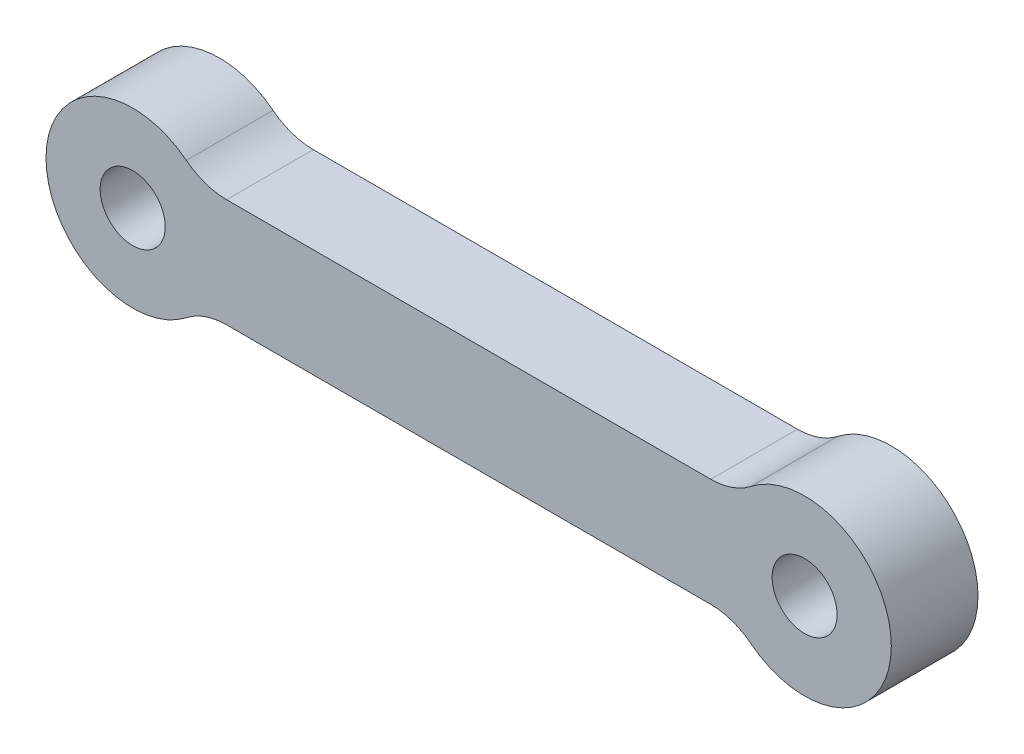
ISO-10303-21;
HEADER;
FILE_DESCRIPTION(('STEP AP214'),'2;1');
FILE_NAME('part.step','',(''),(''),'','','');
FILE_SCHEMA(('AUTOMOTIVE_DESIGN { 1 0 10303 214 1 1 1 1 }'));
ENDSEC;
DATA;
#1=APPLICATION_CONTEXT('core data for automotive mechanical design processes');
#2=APPLICATION_PROTOCOL_DEFINITION('international standard','automotive_design',2000,#1);
#3=PRODUCT_CONTEXT('',#1,'mechanical');
#4=PRODUCT('Part','Part','',(#3));
#5=PRODUCT_RELATED_PRODUCT_CATEGORY('part','',(#4));
#6=PRODUCT_DEFINITION_FORMATION('','',#4);
#7=PRODUCT_DEFINITION_CONTEXT('part definition',#1,'design');
#8=PRODUCT_DEFINITION('design','',#6,#7);
#9=PRODUCT_DEFINITION_SHAPE('','',#8);
#10=(LENGTH_UNIT() NAMED_UNIT(*) SI_UNIT(.MILLI.,.METRE.));
#11=(NAMED_UNIT(*) PLANE_ANGLE_UNIT() SI_UNIT($,.RADIAN.));
#12=(NAMED_UNIT(*) SI_UNIT($,.STERADIAN.) SOLID_ANGLE_UNIT());
#13=UNCERTAINTY_MEASURE_WITH_UNIT(LENGTH_MEASURE(1.E-05),#10,'distance_accuracy_value','');
#14=(GEOMETRIC_REPRESENTATION_CONTEXT(3) GLOBAL_UNCERTAINTY_ASSIGNED_CONTEXT((#13)) GLOBAL_UNIT_ASSIGNED_CONTEXT((#10,
#11,#12)) REPRESENTATION_CONTEXT('',''));
#15=CARTESIAN_POINT('',(0.,0.,0.));
#16=DIRECTION('',(0.,0.,1.));
#17=DIRECTION('',(1.,0.,0.));
#18=AXIS2_PLACEMENT_3D('',#15,#16,#17);
#19=CARTESIAN_POINT('',(11.1698729810778,-5.5,4.));
#20=DIRECTION('',(0.,0.,-1.));
#21=DIRECTION('',(-1.,0.,0.));
#22=AXIS2_PLACEMENT_3D('',#19,#20,#21);
#23=PLANE('',#22);
#24=CARTESIAN_POINT('',(11.1698729810778,-5.5,4.));
#25=DIRECTION('',(0.,0.,-1.));
#26=DIRECTION('',(-1.,0.,0.));
#27=AXIS2_PLACEMENT_3D('',#24,#25,#26);
#28=CIRCLE('',#27,3.);
#29=CARTESIAN_POINT('',(11.1698729810778,-2.5,4.));
#30=VERTEX_POINT('',#29);
#31=CARTESIAN_POINT('',(13.025641703473,-3.14285714285714,4.));
#32=VERTEX_POINT('',#31);
#33=EDGE_CURVE('E155',#30,#32,#28,.T.);
#34=ORIENTED_EDGE('',*,*,#33,.T.);
#35=CARTESIAN_POINT('',(15.5,0.,4.));
#36=DIRECTION('',(0.,0.,1.));
#37=DIRECTION('',(-1.,0.,0.));
#38=AXIS2_PLACEMENT_3D('',#35,#36,#37);
#39=CIRCLE('',#38,4.);
#40=CARTESIAN_POINT('',(13.025641703473,3.14285714285714,4.));
#41=VERTEX_POINT('',#40);
#42=EDGE_CURVE('E104',#32,#41,#39,.T.);
#43=ORIENTED_EDGE('',*,*,#42,.T.);
#44=CARTESIAN_POINT('',(11.1698729810778,5.5,4.));
#45=DIRECTION('',(0.,0.,-1.));
#46=DIRECTION('',(-1.,0.,0.));
#47=AXIS2_PLACEMENT_3D('',#44,#45,#46);
#48=CIRCLE('',#47,3.);
#49=CARTESIAN_POINT('',(11.1698729810778,2.5,4.));
#50=VERTEX_POINT('',#49);
#51=EDGE_CURVE('E169',#41,#50,#48,.T.);
#52=ORIENTED_EDGE('',*,*,#51,.T.);
#53=DIRECTION('',(-1.,0.,0.));
#54=VECTOR('',#53,1.);
#55=CARTESIAN_POINT('',(11.1698729810778,2.5,4.));
#56=LINE('',#55,#54);
#57=CARTESIAN_POINT('',(-11.1698729810778,2.5,4.));
#58=VERTEX_POINT('',#57);
#59=EDGE_CURVE('E183',#50,#58,#56,.T.);
#60=ORIENTED_EDGE('',*,*,#59,.T.);
#61=CARTESIAN_POINT('',(-11.1698729810778,5.5,4.));
#62=DIRECTION('',(0.,0.,-1.));
#63=DIRECTION('',(-1.,0.,0.));
#64=AXIS2_PLACEMENT_3D('',#61,#62,#63);
#65=CIRCLE('',#64,3.);
#66=CARTESIAN_POINT('',(-13.025641703473,3.14285714285714,4.));
#67=VERTEX_POINT('',#66);
#68=EDGE_CURVE('E122',#58,#67,#65,.T.);
#69=ORIENTED_EDGE('',*,*,#68,.T.);
#70=CARTESIAN_POINT('',(-15.5,0.,4.));
#71=DIRECTION('',(0.,0.,1.));
#72=DIRECTION('',(1.,0.,0.));
#73=AXIS2_PLACEMENT_3D('',#70,#71,#72);
#74=CIRCLE('',#73,4.);
#75=CARTESIAN_POINT('',(-13.025641703473,-3.14285714285714,4.));
#76=VERTEX_POINT('',#75);
#77=EDGE_CURVE('E116',#67,#76,#74,.T.);
#78=ORIENTED_EDGE('',*,*,#77,.T.);
#79=CARTESIAN_POINT('',(-11.1698729810778,-5.5,4.));
#80=DIRECTION('',(0.,0.,-1.));
#81=DIRECTION('',(1.,0.,0.));
#82=AXIS2_PLACEMENT_3D('',#79,#80,#81);
#83=CIRCLE('',#82,3.);
#84=CARTESIAN_POINT('',(-11.1698729810778,-2.5,4.));
#85=VERTEX_POINT('',#84);
#86=EDGE_CURVE('E120',#76,#85,#83,.T.);
#87=ORIENTED_EDGE('',*,*,#86,.T.);
#88=DIRECTION('',(1.,0.,0.));
#89=VECTOR('',#88,1.);
#90=CARTESIAN_POINT('',(11.1698729810778,-2.5,4.));
#91=LINE('',#90,#89);
#92=EDGE_CURVE('E58',#85,#30,#91,.T.);
#93=ORIENTED_EDGE('',*,*,#92,.T.);
#94=EDGE_LOOP('',(#34,#43,#52,#60,#69,#78,#87,#93));
#95=FACE_BOUND('',#94,.T.);
#96=CARTESIAN_POINT('',(-15.5,0.,4.));
#97=DIRECTION('',(0.,0.,1.));
#98=DIRECTION('',(1.,0.,0.));
#99=AXIS2_PLACEMENT_3D('',#96,#97,#98);
#100=CIRCLE('',#99,1.5);
#101=CARTESIAN_POINT('',(-14.,0.,4.));
#102=VERTEX_POINT('',#101);
#103=EDGE_CURVE('E143',#102,#102,#100,.T.);
#104=ORIENTED_EDGE('',*,*,#103,.F.);
#105=EDGE_LOOP('',(#104));
#106=FACE_BOUND('',#105,.T.);
#107=CARTESIAN_POINT('',(15.5,0.,4.));
#108=DIRECTION('',(0.,0.,1.));
#109=DIRECTION('',(-1.,0.,0.));
#110=AXIS2_PLACEMENT_3D('',#107,#108,#109);
#111=CIRCLE('',#110,1.5);
#112=CARTESIAN_POINT('',(14.,0.,4.));
#113=VERTEX_POINT('',#112);
#114=EDGE_CURVE('E195',#113,#113,#111,.T.);
#115=ORIENTED_EDGE('',*,*,#114,.F.);
#116=EDGE_LOOP('',(#115));
#117=FACE_BOUND('',#116,.T.);
#118=ADVANCED_FACE('F43',(#95,#106,#117),#23,.F.);
#119=CARTESIAN_POINT('',(11.1698729810778,-5.5,0.));
#120=DIRECTION('',(0.,0.,-1.));
#121=DIRECTION('',(-1.,0.,0.));
#122=AXIS2_PLACEMENT_3D('',#119,#120,#121);
#123=PLANE('',#122);
#124=CARTESIAN_POINT('',(-15.5,0.,0.));
#125=DIRECTION('',(0.,0.,1.));
#126=DIRECTION('',(1.,0.,0.));
#127=AXIS2_PLACEMENT_3D('',#124,#125,#126);
#128=CIRCLE('',#127,1.5);
#129=CARTESIAN_POINT('',(-14.,0.,0.));
#130=VERTEX_POINT('',#129);
#131=EDGE_CURVE('E188',#130,#130,#128,.T.);
#132=ORIENTED_EDGE('',*,*,#131,.T.);
#133=EDGE_LOOP('',(#132));
#134=FACE_BOUND('',#133,.T.);
#135=CARTESIAN_POINT('',(11.1698729810778,-5.5,0.));
#136=DIRECTION('',(0.,0.,-1.));
#137=DIRECTION('',(-1.,0.,0.));
#138=AXIS2_PLACEMENT_3D('',#135,#136,#137);
#139=CIRCLE('',#138,3.);
#140=CARTESIAN_POINT('',(11.1698729810778,-2.5,0.));
#141=VERTEX_POINT('',#140);
#142=CARTESIAN_POINT('',(13.025641703473,-3.14285714285714,0.));
#143=VERTEX_POINT('',#142);
#144=EDGE_CURVE('E139',#141,#143,#139,.T.);
#145=ORIENTED_EDGE('',*,*,#144,.F.);
#146=DIRECTION('',(1.,0.,0.));
#147=VECTOR('',#146,1.);
#148=CARTESIAN_POINT('',(11.1698729810778,-2.5,0.));
#149=LINE('',#148,#147);
#150=CARTESIAN_POINT('',(-11.1698729810778,-2.5,0.));
#151=VERTEX_POINT('',#150);
#152=EDGE_CURVE('E94',#151,#141,#149,.T.);
#153=ORIENTED_EDGE('',*,*,#152,.F.);
#154=CARTESIAN_POINT('',(-11.1698729810778,-5.5,0.));
#155=DIRECTION('',(0.,0.,-1.));
#156=DIRECTION('',(1.,0.,0.));
#157=AXIS2_PLACEMENT_3D('',#154,#155,#156);
#158=CIRCLE('',#157,3.);
#159=CARTESIAN_POINT('',(-13.025641703473,-3.14285714285714,0.));
#160=VERTEX_POINT('',#159);
#161=EDGE_CURVE('E87',#160,#151,#158,.T.);
#162=ORIENTED_EDGE('',*,*,#161,.F.);
#163=CARTESIAN_POINT('',(-15.5,0.,0.));
#164=DIRECTION('',(0.,0.,1.));
#165=DIRECTION('',(1.,0.,0.));
#166=AXIS2_PLACEMENT_3D('',#163,#164,#165);
#167=CIRCLE('',#166,4.);
#168=CARTESIAN_POINT('',(-13.025641703473,3.14285714285714,0.));
#169=VERTEX_POINT('',#168);
#170=EDGE_CURVE('E127',#169,#160,#167,.T.);
#171=ORIENTED_EDGE('',*,*,#170,.F.);
#172=CARTESIAN_POINT('',(-11.1698729810778,5.5,0.));
#173=DIRECTION('',(0.,0.,-1.));
#174=DIRECTION('',(-1.,0.,0.));
#175=AXIS2_PLACEMENT_3D('',#172,#173,#174);
#176=CIRCLE('',#175,3.);
#177=CARTESIAN_POINT('',(-11.1698729810778,2.5,0.));
#178=VERTEX_POINT('',#177);
#179=EDGE_CURVE('E148',#178,#169,#176,.T.);
#180=ORIENTED_EDGE('',*,*,#179,.F.);
#181=DIRECTION('',(-1.,0.,0.));
#182=VECTOR('',#181,1.);
#183=CARTESIAN_POINT('',(11.1698729810778,2.5,0.));
#184=LINE('',#183,#182);
#185=CARTESIAN_POINT('',(11.1698729810778,2.5,0.));
#186=VERTEX_POINT('',#185);
#187=EDGE_CURVE('E149',#186,#178,#184,.T.);
#188=ORIENTED_EDGE('',*,*,#187,.F.);
#189=CARTESIAN_POINT('',(11.1698729810778,5.5,0.));
#190=DIRECTION('',(0.,0.,-1.));
#191=DIRECTION('',(-1.,0.,0.));
#192=AXIS2_PLACEMENT_3D('',#189,#190,#191);
#193=CIRCLE('',#192,3.);
#194=CARTESIAN_POINT('',(13.025641703473,3.14285714285714,0.));
#195=VERTEX_POINT('',#194);
#196=EDGE_CURVE('E147',#195,#186,#193,.T.);
#197=ORIENTED_EDGE('',*,*,#196,.F.);
#198=CARTESIAN_POINT('',(15.5,0.,0.));
#199=DIRECTION('',(0.,0.,1.));
#200=DIRECTION('',(-1.,0.,0.));
#201=AXIS2_PLACEMENT_3D('',#198,#199,#200);
#202=CIRCLE('',#201,4.);
#203=EDGE_CURVE('E142',#143,#195,#202,.T.);
#204=ORIENTED_EDGE('',*,*,#203,.F.);
#205=EDGE_LOOP('',(#145,#153,#162,#171,#180,#188,#197,#204));
#206=FACE_BOUND('',#205,.T.);
#207=CARTESIAN_POINT('',(15.5,0.,0.));
#208=DIRECTION('',(0.,0.,1.));
#209=DIRECTION('',(-1.,0.,0.));
#210=AXIS2_PLACEMENT_3D('',#207,#208,#209);
#211=CIRCLE('',#210,1.5);
#212=CARTESIAN_POINT('',(14.,0.,0.));
#213=VERTEX_POINT('',#212);
#214=EDGE_CURVE('E193',#213,#213,#211,.T.);
#215=ORIENTED_EDGE('',*,*,#214,.T.);
#216=EDGE_LOOP('',(#215));
#217=FACE_BOUND('',#216,.T.);
#218=ADVANCED_FACE('F174',(#134,#206,#217),#123,.T.);
#219=CARTESIAN_POINT('',(11.1698729810778,-5.5,4.));
#220=DIRECTION('',(0.,0.,-1.));
#221=DIRECTION('',(-1.,0.,0.));
#222=AXIS2_PLACEMENT_3D('',#219,#220,#221);
#223=CYLINDRICAL_SURFACE('',#222,3.);
#224=ORIENTED_EDGE('',*,*,#144,.T.);
#225=DIRECTION('',(0.,0.,-1.));
#226=VECTOR('',#225,1.);
#227=CARTESIAN_POINT('',(13.025641703473,-3.14285714285714,4.));
#228=LINE('',#227,#226);
#229=EDGE_CURVE('E11',#32,#143,#228,.T.);
#230=ORIENTED_EDGE('',*,*,#229,.F.);
#231=ORIENTED_EDGE('',*,*,#33,.F.);
#232=DIRECTION('',(0.,0.,-1.));
#233=VECTOR('',#232,1.);
#234=CARTESIAN_POINT('',(11.1698729810778,-2.5,4.));
#235=LINE('',#234,#233);
#236=EDGE_CURVE('E136',#30,#141,#235,.T.);
#237=ORIENTED_EDGE('',*,*,#236,.T.);
#238=EDGE_LOOP('',(#224,#230,#231,#237));
#239=FACE_BOUND('',#238,.T.);
#240=ADVANCED_FACE('F44',(#239),#223,.F.);
#241=CARTESIAN_POINT('',(15.5,0.,4.));
#242=DIRECTION('',(0.,0.,-1.));
#243=DIRECTION('',(-1.,0.,0.));
#244=AXIS2_PLACEMENT_3D('',#241,#242,#243);
#245=CYLINDRICAL_SURFACE('',#244,4.);
#246=ORIENTED_EDGE('',*,*,#203,.T.);
#247=DIRECTION('',(0.,0.,-1.));
#248=VECTOR('',#247,1.);
#249=CARTESIAN_POINT('',(13.025641703473,3.14285714285714,4.));
#250=LINE('',#249,#248);
#251=EDGE_CURVE('E55',#41,#195,#250,.T.);
#252=ORIENTED_EDGE('',*,*,#251,.F.);
#253=ORIENTED_EDGE('',*,*,#42,.F.);
#254=ORIENTED_EDGE('',*,*,#229,.T.);
#255=EDGE_LOOP('',(#246,#252,#253,#254));
#256=FACE_BOUND('',#255,.T.);
#257=ADVANCED_FACE('F230',(#256),#245,.T.);
#258=CARTESIAN_POINT('',(11.1698729810778,5.5,4.));
#259=DIRECTION('',(0.,0.,-1.));
#260=DIRECTION('',(-1.,0.,0.));
#261=AXIS2_PLACEMENT_3D('',#258,#259,#260);
#262=CYLINDRICAL_SURFACE('',#261,3.);
#263=ORIENTED_EDGE('',*,*,#196,.T.);
#264=DIRECTION('',(0.,0.,-1.));
#265=VECTOR('',#264,1.);
#266=CARTESIAN_POINT('',(11.1698729810778,2.5,4.));
#267=LINE('',#266,#265);
#268=EDGE_CURVE('E162',#50,#186,#267,.T.);
#269=ORIENTED_EDGE('',*,*,#268,.F.);
#270=ORIENTED_EDGE('',*,*,#51,.F.);
#271=ORIENTED_EDGE('',*,*,#251,.T.);
#272=EDGE_LOOP('',(#263,#269,#270,#271));
#273=FACE_BOUND('',#272,.T.);
#274=ADVANCED_FACE('F166',(#273),#262,.F.);
#275=CARTESIAN_POINT('',(11.1698729810778,2.5,4.));
#276=DIRECTION('',(0.,-1.,0.));
#277=DIRECTION('',(0.,0.,-1.));
#278=AXIS2_PLACEMENT_3D('',#275,#276,#277);
#279=PLANE('',#278);
#280=ORIENTED_EDGE('',*,*,#187,.T.);
#281=DIRECTION('',(0.,0.,-1.));
#282=VECTOR('',#281,1.);
#283=CARTESIAN_POINT('',(-11.1698729810778,2.5,4.));
#284=LINE('',#283,#282);
#285=EDGE_CURVE('E159',#58,#178,#284,.T.);
#286=ORIENTED_EDGE('',*,*,#285,.F.);
#287=ORIENTED_EDGE('',*,*,#59,.F.);
#288=ORIENTED_EDGE('',*,*,#268,.T.);
#289=EDGE_LOOP('',(#280,#286,#287,#288));
#290=FACE_BOUND('',#289,.T.);
#291=ADVANCED_FACE('F177',(#290),#279,.F.);
#292=CARTESIAN_POINT('',(-11.1698729810778,5.5,4.));
#293=DIRECTION('',(0.,0.,-1.));
#294=DIRECTION('',(-1.,0.,0.));
#295=AXIS2_PLACEMENT_3D('',#292,#293,#294);
#296=CYLINDRICAL_SURFACE('',#295,3.);
#297=ORIENTED_EDGE('',*,*,#179,.T.);
#298=DIRECTION('',(0.,0.,-1.));
#299=VECTOR('',#298,1.);
#300=CARTESIAN_POINT('',(-13.025641703473,3.14285714285714,4.));
#301=LINE('',#300,#299);
#302=EDGE_CURVE('E131',#67,#169,#301,.T.);
#303=ORIENTED_EDGE('',*,*,#302,.F.);
#304=ORIENTED_EDGE('',*,*,#68,.F.);
#305=ORIENTED_EDGE('',*,*,#285,.T.);
#306=EDGE_LOOP('',(#297,#303,#304,#305));
#307=FACE_BOUND('',#306,.T.);
#308=ADVANCED_FACE('F185',(#307),#296,.F.);
#309=CARTESIAN_POINT('',(-15.5,0.,4.));
#310=DIRECTION('',(0.,0.,-1.));
#311=DIRECTION('',(-1.,0.,0.));
#312=AXIS2_PLACEMENT_3D('',#309,#310,#311);
#313=CYLINDRICAL_SURFACE('',#312,4.);
#314=ORIENTED_EDGE('',*,*,#170,.T.);
#315=DIRECTION('',(0.,0.,-1.));
#316=VECTOR('',#315,1.);
#317=CARTESIAN_POINT('',(-13.025641703473,-3.14285714285714,4.));
#318=LINE('',#317,#316);
#319=EDGE_CURVE('E130',#76,#160,#318,.T.);
#320=ORIENTED_EDGE('',*,*,#319,.F.);
#321=ORIENTED_EDGE('',*,*,#77,.F.);
#322=ORIENTED_EDGE('',*,*,#302,.T.);
#323=EDGE_LOOP('',(#314,#320,#321,#322));
#324=FACE_BOUND('',#323,.T.);
#325=ADVANCED_FACE('F126',(#324),#313,.T.);
#326=CARTESIAN_POINT('',(-11.1698729810778,-5.5,4.));
#327=DIRECTION('',(0.,0.,-1.));
#328=DIRECTION('',(-1.,0.,0.));
#329=AXIS2_PLACEMENT_3D('',#326,#327,#328);
#330=CYLINDRICAL_SURFACE('',#329,3.);
#331=ORIENTED_EDGE('',*,*,#161,.T.);
#332=DIRECTION('',(0.,0.,-1.));
#333=VECTOR('',#332,1.);
#334=CARTESIAN_POINT('',(-11.1698729810778,-2.5,4.));
#335=LINE('',#334,#333);
#336=EDGE_CURVE('E135',#85,#151,#335,.T.);
#337=ORIENTED_EDGE('',*,*,#336,.F.);
#338=ORIENTED_EDGE('',*,*,#86,.F.);
#339=ORIENTED_EDGE('',*,*,#319,.T.);
#340=EDGE_LOOP('',(#331,#337,#338,#339));
#341=FACE_BOUND('',#340,.T.);
#342=ADVANCED_FACE('F132',(#341),#330,.F.);
#343=CARTESIAN_POINT('',(11.1698729810778,-2.5,4.));
#344=DIRECTION('',(0.,1.,0.));
#345=DIRECTION('',(0.,0.,1.));
#346=AXIS2_PLACEMENT_3D('',#343,#344,#345);
#347=PLANE('',#346);
#348=ORIENTED_EDGE('',*,*,#152,.T.);
#349=ORIENTED_EDGE('',*,*,#236,.F.);
#350=ORIENTED_EDGE('',*,*,#92,.F.);
#351=ORIENTED_EDGE('',*,*,#336,.T.);
#352=EDGE_LOOP('',(#348,#349,#350,#351));
#353=FACE_BOUND('',#352,.T.);
#354=ADVANCED_FACE('F214',(#353),#347,.F.);
#355=CARTESIAN_POINT('',(-15.5,0.,4.));
#356=DIRECTION('',(0.,0.,-1.));
#357=DIRECTION('',(-1.,0.,0.));
#358=AXIS2_PLACEMENT_3D('',#355,#356,#357);
#359=CYLINDRICAL_SURFACE('',#358,1.5);
#360=ORIENTED_EDGE('',*,*,#103,.T.);
#361=EDGE_LOOP('',(#360));
#362=FACE_BOUND('',#361,.T.);
#363=ORIENTED_EDGE('',*,*,#131,.F.);
#364=EDGE_LOOP('',(#363));
#365=FACE_BOUND('',#364,.T.);
#366=ADVANCED_FACE('F212',(#362,#365),#359,.F.);
#367=CARTESIAN_POINT('',(15.5,0.,4.));
#368=DIRECTION('',(0.,0.,-1.));
#369=DIRECTION('',(-1.,0.,0.));
#370=AXIS2_PLACEMENT_3D('',#367,#368,#369);
#371=CYLINDRICAL_SURFACE('',#370,1.5);
#372=ORIENTED_EDGE('',*,*,#114,.T.);
#373=EDGE_LOOP('',(#372));
#374=FACE_BOUND('',#373,.T.);
#375=ORIENTED_EDGE('',*,*,#214,.F.);
#376=EDGE_LOOP('',(#375));
#377=FACE_BOUND('',#376,.T.);
#378=ADVANCED_FACE('F202',(#374,#377),#371,.F.);
#379=CLOSED_SHELL('',(#118,#218,#240,#257,#274,#291,#308,#325,#342,#354,#366,#378));
#380=MANIFOLD_SOLID_BREP('B2',#379);
#381=ADVANCED_BREP_SHAPE_REPRESENTATION('',(#18,#380),#14);
#382=SHAPE_DEFINITION_REPRESENTATION(#9,#381);
ENDSEC;
END-ISO-10303-21;
